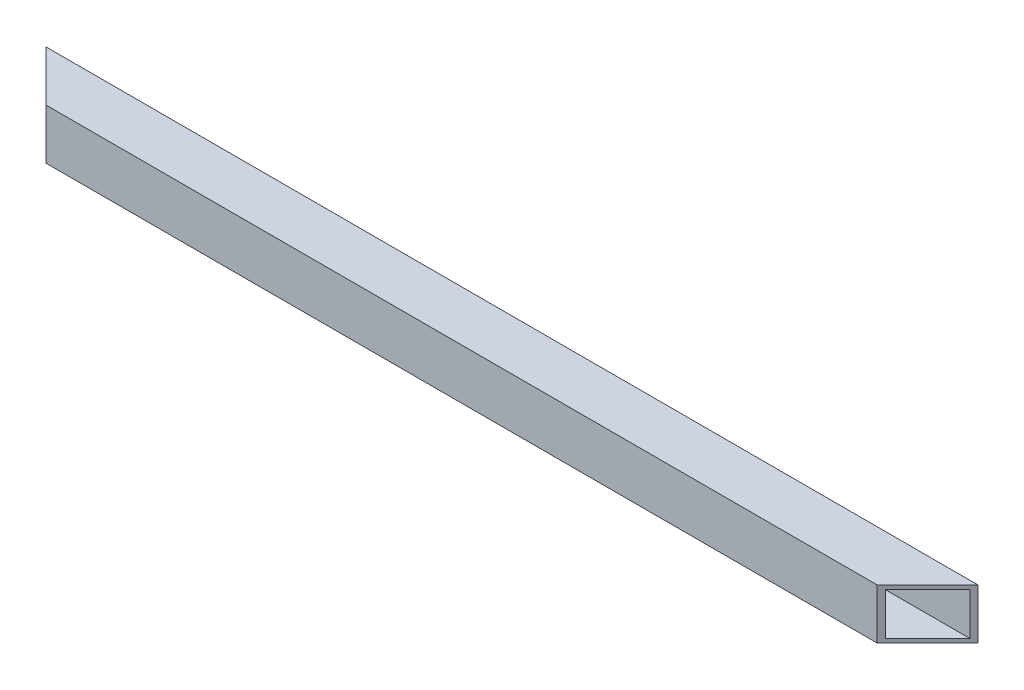
ISO-10303-21;
HEADER;
FILE_DESCRIPTION(('STEP AP214'),'2;1');
FILE_NAME('part.step','',(''),(''),'','','');
FILE_SCHEMA(('AUTOMOTIVE_DESIGN { 1 0 10303 214 1 1 1 1 }'));
ENDSEC;
DATA;
#1=APPLICATION_CONTEXT('core data for automotive mechanical design processes');
#2=APPLICATION_PROTOCOL_DEFINITION('international standard','automotive_design',2000,#1);
#3=PRODUCT_CONTEXT('',#1,'mechanical');
#4=PRODUCT('Part','Part','',(#3));
#5=PRODUCT_RELATED_PRODUCT_CATEGORY('part','',(#4));
#6=PRODUCT_DEFINITION_FORMATION('','',#4);
#7=PRODUCT_DEFINITION_CONTEXT('part definition',#1,'design');
#8=PRODUCT_DEFINITION('design','',#6,#7);
#9=PRODUCT_DEFINITION_SHAPE('','',#8);
#10=(LENGTH_UNIT() NAMED_UNIT(*) SI_UNIT(.MILLI.,.METRE.));
#11=(NAMED_UNIT(*) PLANE_ANGLE_UNIT() SI_UNIT($,.RADIAN.));
#12=(NAMED_UNIT(*) SI_UNIT($,.STERADIAN.) SOLID_ANGLE_UNIT());
#13=UNCERTAINTY_MEASURE_WITH_UNIT(LENGTH_MEASURE(1.E-05),#10,'distance_accuracy_value','');
#14=(GEOMETRIC_REPRESENTATION_CONTEXT(3) GLOBAL_UNCERTAINTY_ASSIGNED_CONTEXT((#13)) GLOBAL_UNIT_ASSIGNED_CONTEXT((#10,
#11,#12)) REPRESENTATION_CONTEXT('',''));
#15=CARTESIAN_POINT('',(0.,0.,0.));
#16=DIRECTION('',(0.,0.,1.));
#17=DIRECTION('',(1.,0.,0.));
#18=AXIS2_PLACEMENT_3D('',#15,#16,#17);
#19=CARTESIAN_POINT('',(-175.,-10.,-2290.));
#20=DIRECTION('',(0.,1.,0.));
#21=DIRECTION('',(0.,0.,1.));
#22=AXIS2_PLACEMENT_3D('',#19,#20,#21);
#23=PLANE('',#22);
#24=DIRECTION('',(0.707106781186548,0.,-0.707106781186548));
#25=VECTOR('',#24,1.);
#26=CARTESIAN_POINT('',(-5.00000000000003,-10.,-2120.));
#27=LINE('',#26,#25);
#28=CARTESIAN_POINT('',(165.,-10.,-2290.));
#29=VERTEX_POINT('',#28);
#30=CARTESIAN_POINT('',(185.,-10.,-2310.));
#31=VERTEX_POINT('',#30);
#32=EDGE_CURVE('E116',#29,#31,#27,.T.);
#33=ORIENTED_EDGE('',*,*,#32,.F.);
#34=DIRECTION('',(1.,0.,0.));
#35=VECTOR('',#34,1.);
#36=CARTESIAN_POINT('',(-175.,-10.,-2290.));
#37=LINE('',#36,#35);
#38=CARTESIAN_POINT('',(-165.,-10.,-2290.));
#39=VERTEX_POINT('',#38);
#40=EDGE_CURVE('E53',#39,#29,#37,.T.);
#41=ORIENTED_EDGE('',*,*,#40,.F.);
#42=DIRECTION('',(0.707106781186548,0.,0.707106781186548));
#43=VECTOR('',#42,1.);
#44=CARTESIAN_POINT('',(-170.,-10.,-2295.));
#45=LINE('',#44,#43);
#46=CARTESIAN_POINT('',(-185.,-10.,-2310.));
#47=VERTEX_POINT('',#46);
#48=EDGE_CURVE('E128',#47,#39,#45,.T.);
#49=ORIENTED_EDGE('',*,*,#48,.F.);
#50=DIRECTION('',(1.,0.,0.));
#51=VECTOR('',#50,1.);
#52=CARTESIAN_POINT('',(-175.,-10.,-2310.));
#53=LINE('',#52,#51);
#54=EDGE_CURVE('E135',#47,#31,#53,.T.);
#55=ORIENTED_EDGE('',*,*,#54,.T.);
#56=EDGE_LOOP('',(#33,#41,#49,#55));
#57=FACE_BOUND('',#56,.T.);
#58=ADVANCED_FACE('F39',(#57),#23,.F.);
#59=CARTESIAN_POINT('',(-175.,-10.,-2290.));
#60=DIRECTION('',(0.,0.,-1.));
#61=DIRECTION('',(-1.,0.,0.));
#62=AXIS2_PLACEMENT_3D('',#59,#60,#61);
#63=PLANE('',#62);
#64=DIRECTION('',(0.,-1.,0.));
#65=VECTOR('',#64,1.);
#66=CARTESIAN_POINT('',(165.,-10.,-2290.));
#67=LINE('',#66,#65);
#68=CARTESIAN_POINT('',(165.,10.,-2290.));
#69=VERTEX_POINT('',#68);
#70=EDGE_CURVE('E158',#69,#29,#67,.T.);
#71=ORIENTED_EDGE('',*,*,#70,.F.);
#72=DIRECTION('',(1.,0.,0.));
#73=VECTOR('',#72,1.);
#74=CARTESIAN_POINT('',(-175.,10.,-2290.));
#75=LINE('',#74,#73);
#76=CARTESIAN_POINT('',(-165.,10.,-2290.));
#77=VERTEX_POINT('',#76);
#78=EDGE_CURVE('E125',#77,#69,#75,.T.);
#79=ORIENTED_EDGE('',*,*,#78,.F.);
#80=DIRECTION('',(0.,1.,0.));
#81=VECTOR('',#80,1.);
#82=CARTESIAN_POINT('',(-165.,-10.,-2290.));
#83=LINE('',#82,#81);
#84=EDGE_CURVE('E173',#39,#77,#83,.T.);
#85=ORIENTED_EDGE('',*,*,#84,.F.);
#86=ORIENTED_EDGE('',*,*,#40,.T.);
#87=EDGE_LOOP('',(#71,#79,#85,#86));
#88=FACE_BOUND('',#87,.T.);
#89=ADVANCED_FACE('F181',(#88),#63,.F.);
#90=CARTESIAN_POINT('',(-175.,10.,-2290.));
#91=DIRECTION('',(0.,-1.,0.));
#92=DIRECTION('',(0.,0.,-1.));
#93=AXIS2_PLACEMENT_3D('',#90,#91,#92);
#94=PLANE('',#93);
#95=DIRECTION('',(-0.707106781186548,0.,0.707106781186548));
#96=VECTOR('',#95,1.);
#97=CARTESIAN_POINT('',(-5.00000000000003,10.,-2120.));
#98=LINE('',#97,#96);
#99=CARTESIAN_POINT('',(184.999999999999,10.,-2310.));
#100=VERTEX_POINT('',#99);
#101=EDGE_CURVE('E161',#100,#69,#98,.T.);
#102=ORIENTED_EDGE('',*,*,#101,.F.);
#103=DIRECTION('',(1.,0.,0.));
#104=VECTOR('',#103,1.);
#105=CARTESIAN_POINT('',(-175.,10.,-2310.));
#106=LINE('',#105,#104);
#107=CARTESIAN_POINT('',(-185.,10.,-2310.));
#108=VERTEX_POINT('',#107);
#109=EDGE_CURVE('E137',#108,#100,#106,.T.);
#110=ORIENTED_EDGE('',*,*,#109,.F.);
#111=DIRECTION('',(-0.707106781186548,0.,-0.707106781186548));
#112=VECTOR('',#111,1.);
#113=CARTESIAN_POINT('',(-170.,10.,-2295.));
#114=LINE('',#113,#112);
#115=EDGE_CURVE('E171',#77,#108,#114,.T.);
#116=ORIENTED_EDGE('',*,*,#115,.F.);
#117=ORIENTED_EDGE('',*,*,#78,.T.);
#118=EDGE_LOOP('',(#102,#110,#116,#117));
#119=FACE_BOUND('',#118,.T.);
#120=ADVANCED_FACE('F183',(#119),#94,.F.);
#121=CARTESIAN_POINT('',(-175.,-10.,-2310.));
#122=DIRECTION('',(0.,0.,1.));
#123=DIRECTION('',(1.,0.,0.));
#124=AXIS2_PLACEMENT_3D('',#121,#122,#123);
#125=PLANE('',#124);
#126=DIRECTION('',(0.,1.,0.));
#127=VECTOR('',#126,1.);
#128=CARTESIAN_POINT('',(185.,-10.,-2310.));
#129=LINE('',#128,#127);
#130=EDGE_CURVE('E150',#31,#100,#129,.T.);
#131=ORIENTED_EDGE('',*,*,#130,.F.);
#132=ORIENTED_EDGE('',*,*,#54,.F.);
#133=DIRECTION('',(0.,-1.,0.));
#134=VECTOR('',#133,1.);
#135=CARTESIAN_POINT('',(-185.,-10.,-2310.));
#136=LINE('',#135,#134);
#137=EDGE_CURVE('E168',#108,#47,#136,.T.);
#138=ORIENTED_EDGE('',*,*,#137,.F.);
#139=ORIENTED_EDGE('',*,*,#109,.T.);
#140=EDGE_LOOP('',(#131,#132,#138,#139));
#141=FACE_BOUND('',#140,.T.);
#142=ADVANCED_FACE('F185',(#141),#125,.F.);
#143=CARTESIAN_POINT('',(-175.,0.,-2300.));
#144=DIRECTION('',(-0.707106781186548,0.,0.707106781186548));
#145=DIRECTION('',(0.707106781186548,0.,0.707106781186548));
#146=AXIS2_PLACEMENT_3D('',#143,#144,#145);
#147=PLANE('',#146);
#148=DIRECTION('',(0.,-1.,0.));
#149=VECTOR('',#148,1.);
#150=CARTESIAN_POINT('',(-183.4,-8.40000000000002,-2308.4));
#151=LINE('',#150,#149);
#152=CARTESIAN_POINT('',(-183.4,8.39999999999999,-2308.4));
#153=VERTEX_POINT('',#152);
#154=CARTESIAN_POINT('',(-183.4,-8.40000000000002,-2308.4));
#155=VERTEX_POINT('',#154);
#156=EDGE_CURVE('E121',#153,#155,#151,.T.);
#157=ORIENTED_EDGE('',*,*,#156,.F.);
#158=DIRECTION('',(-0.707106781186548,0.,-0.707106781186548));
#159=VECTOR('',#158,1.);
#160=CARTESIAN_POINT('',(-170.8,8.39999999999999,-2295.8));
#161=LINE('',#160,#159);
#162=CARTESIAN_POINT('',(-166.6,8.39999999999999,-2291.6));
#163=VERTEX_POINT('',#162);
#164=EDGE_CURVE('E147',#163,#153,#161,.T.);
#165=ORIENTED_EDGE('',*,*,#164,.F.);
#166=DIRECTION('',(0.,1.,0.));
#167=VECTOR('',#166,1.);
#168=CARTESIAN_POINT('',(-166.6,-8.39999999999999,-2291.6));
#169=LINE('',#168,#167);
#170=CARTESIAN_POINT('',(-166.6,-8.39999999999999,-2291.6));
#171=VERTEX_POINT('',#170);
#172=EDGE_CURVE('E145',#171,#163,#169,.T.);
#173=ORIENTED_EDGE('',*,*,#172,.F.);
#174=DIRECTION('',(0.707106781186548,0.,0.707106781186548));
#175=VECTOR('',#174,1.);
#176=CARTESIAN_POINT('',(-170.8,-8.4,-2295.8));
#177=LINE('',#176,#175);
#178=EDGE_CURVE('E46',#155,#171,#177,.T.);
#179=ORIENTED_EDGE('',*,*,#178,.F.);
#180=EDGE_LOOP('',(#157,#165,#173,#179));
#181=FACE_BOUND('',#180,.T.);
#182=ORIENTED_EDGE('',*,*,#137,.T.);
#183=ORIENTED_EDGE('',*,*,#48,.T.);
#184=ORIENTED_EDGE('',*,*,#84,.T.);
#185=ORIENTED_EDGE('',*,*,#115,.T.);
#186=EDGE_LOOP('',(#182,#183,#184,#185));
#187=FACE_BOUND('',#186,.T.);
#188=ADVANCED_FACE('F142',(#181,#187),#147,.T.);
#189=CARTESIAN_POINT('',(-175.,-8.40000000000002,-2308.4));
#190=DIRECTION('',(0.,0.,1.));
#191=DIRECTION('',(1.,0.,0.));
#192=AXIS2_PLACEMENT_3D('',#189,#190,#191);
#193=PLANE('',#192);
#194=DIRECTION('',(1.,0.,0.));
#195=VECTOR('',#194,1.);
#196=CARTESIAN_POINT('',(-175.,-8.40000000000002,-2308.4));
#197=LINE('',#196,#195);
#198=CARTESIAN_POINT('',(183.4,-8.40000000000002,-2308.4));
#199=VERTEX_POINT('',#198);
#200=EDGE_CURVE('E112',#155,#199,#197,.T.);
#201=ORIENTED_EDGE('',*,*,#200,.T.);
#202=DIRECTION('',(0.,1.,0.));
#203=VECTOR('',#202,1.);
#204=CARTESIAN_POINT('',(183.4,-8.40000000000002,-2308.4));
#205=LINE('',#204,#203);
#206=CARTESIAN_POINT('',(183.4,8.39999999999999,-2308.4));
#207=VERTEX_POINT('',#206);
#208=EDGE_CURVE('E11',#199,#207,#205,.T.);
#209=ORIENTED_EDGE('',*,*,#208,.T.);
#210=DIRECTION('',(1.,0.,0.));
#211=VECTOR('',#210,1.);
#212=CARTESIAN_POINT('',(-175.,8.39999999999999,-2308.4));
#213=LINE('',#212,#211);
#214=EDGE_CURVE('E133',#153,#207,#213,.T.);
#215=ORIENTED_EDGE('',*,*,#214,.F.);
#216=ORIENTED_EDGE('',*,*,#156,.T.);
#217=EDGE_LOOP('',(#201,#209,#215,#216));
#218=FACE_BOUND('',#217,.T.);
#219=ADVANCED_FACE('F120',(#218),#193,.T.);
#220=CARTESIAN_POINT('',(-175.,8.39999999999999,-2291.6));
#221=DIRECTION('',(0.,-1.,0.));
#222=DIRECTION('',(0.,0.,-1.));
#223=AXIS2_PLACEMENT_3D('',#220,#221,#222);
#224=PLANE('',#223);
#225=ORIENTED_EDGE('',*,*,#214,.T.);
#226=DIRECTION('',(-0.707106781186548,0.,0.707106781186548));
#227=VECTOR('',#226,1.);
#228=CARTESIAN_POINT('',(-4.20000000000012,8.39999999999999,-2120.8));
#229=LINE('',#228,#227);
#230=CARTESIAN_POINT('',(166.6,8.39999999999999,-2291.6));
#231=VERTEX_POINT('',#230);
#232=EDGE_CURVE('E61',#207,#231,#229,.T.);
#233=ORIENTED_EDGE('',*,*,#232,.T.);
#234=DIRECTION('',(1.,0.,0.));
#235=VECTOR('',#234,1.);
#236=CARTESIAN_POINT('',(-175.,8.39999999999999,-2291.6));
#237=LINE('',#236,#235);
#238=EDGE_CURVE('E123',#163,#231,#237,.T.);
#239=ORIENTED_EDGE('',*,*,#238,.F.);
#240=ORIENTED_EDGE('',*,*,#164,.T.);
#241=EDGE_LOOP('',(#225,#233,#239,#240));
#242=FACE_BOUND('',#241,.T.);
#243=ADVANCED_FACE('F224',(#242),#224,.T.);
#244=CARTESIAN_POINT('',(-175.,-8.39999999999999,-2291.6));
#245=DIRECTION('',(0.,0.,-1.));
#246=DIRECTION('',(-1.,0.,0.));
#247=AXIS2_PLACEMENT_3D('',#244,#245,#246);
#248=PLANE('',#247);
#249=ORIENTED_EDGE('',*,*,#238,.T.);
#250=DIRECTION('',(0.,-1.,0.));
#251=VECTOR('',#250,1.);
#252=CARTESIAN_POINT('',(166.6,-8.39999999999999,-2291.6));
#253=LINE('',#252,#251);
#254=CARTESIAN_POINT('',(166.6,-8.39999999999999,-2291.6));
#255=VERTEX_POINT('',#254);
#256=EDGE_CURVE('E117',#231,#255,#253,.T.);
#257=ORIENTED_EDGE('',*,*,#256,.T.);
#258=DIRECTION('',(1.,0.,0.));
#259=VECTOR('',#258,1.);
#260=CARTESIAN_POINT('',(-175.,-8.39999999999999,-2291.6));
#261=LINE('',#260,#259);
#262=EDGE_CURVE('E114',#171,#255,#261,.T.);
#263=ORIENTED_EDGE('',*,*,#262,.F.);
#264=ORIENTED_EDGE('',*,*,#172,.T.);
#265=EDGE_LOOP('',(#249,#257,#263,#264));
#266=FACE_BOUND('',#265,.T.);
#267=ADVANCED_FACE('F152',(#266),#248,.T.);
#268=CARTESIAN_POINT('',(-175.,-8.39999999999999,-2291.6));
#269=DIRECTION('',(0.,1.,0.));
#270=DIRECTION('',(0.,0.,1.));
#271=AXIS2_PLACEMENT_3D('',#268,#269,#270);
#272=PLANE('',#271);
#273=ORIENTED_EDGE('',*,*,#262,.T.);
#274=DIRECTION('',(0.707106781186548,0.,-0.707106781186548));
#275=VECTOR('',#274,1.);
#276=CARTESIAN_POINT('',(-4.20000000000012,-8.39999999999971,-2120.8));
#277=LINE('',#276,#275);
#278=EDGE_CURVE('E103',#255,#199,#277,.T.);
#279=ORIENTED_EDGE('',*,*,#278,.T.);
#280=ORIENTED_EDGE('',*,*,#200,.F.);
#281=ORIENTED_EDGE('',*,*,#178,.T.);
#282=EDGE_LOOP('',(#273,#279,#280,#281));
#283=FACE_BOUND('',#282,.T.);
#284=ADVANCED_FACE('F110',(#283),#272,.T.);
#285=CARTESIAN_POINT('',(175.,0.,-2300.));
#286=DIRECTION('',(0.707106781186548,0.,0.707106781186548));
#287=DIRECTION('',(0.707106781186548,0.,-0.707106781186548));
#288=AXIS2_PLACEMENT_3D('',#285,#286,#287);
#289=PLANE('',#288);
#290=ORIENTED_EDGE('',*,*,#278,.F.);
#291=ORIENTED_EDGE('',*,*,#256,.F.);
#292=ORIENTED_EDGE('',*,*,#232,.F.);
#293=ORIENTED_EDGE('',*,*,#208,.F.);
#294=EDGE_LOOP('',(#290,#291,#292,#293));
#295=FACE_BOUND('',#294,.T.);
#296=ORIENTED_EDGE('',*,*,#32,.T.);
#297=ORIENTED_EDGE('',*,*,#130,.T.);
#298=ORIENTED_EDGE('',*,*,#101,.T.);
#299=ORIENTED_EDGE('',*,*,#70,.T.);
#300=EDGE_LOOP('',(#296,#297,#298,#299));
#301=FACE_BOUND('',#300,.T.);
#302=ADVANCED_FACE('F101',(#295,#301),#289,.T.);
#303=CLOSED_SHELL('',(#58,#89,#120,#142,#188,#219,#243,#267,#284,#302));
#304=MANIFOLD_SOLID_BREP('B2',#303);
#305=ADVANCED_BREP_SHAPE_REPRESENTATION('',(#18,#304),#14);
#306=SHAPE_DEFINITION_REPRESENTATION(#9,#305);
ENDSEC;
END-ISO-10303-21;
